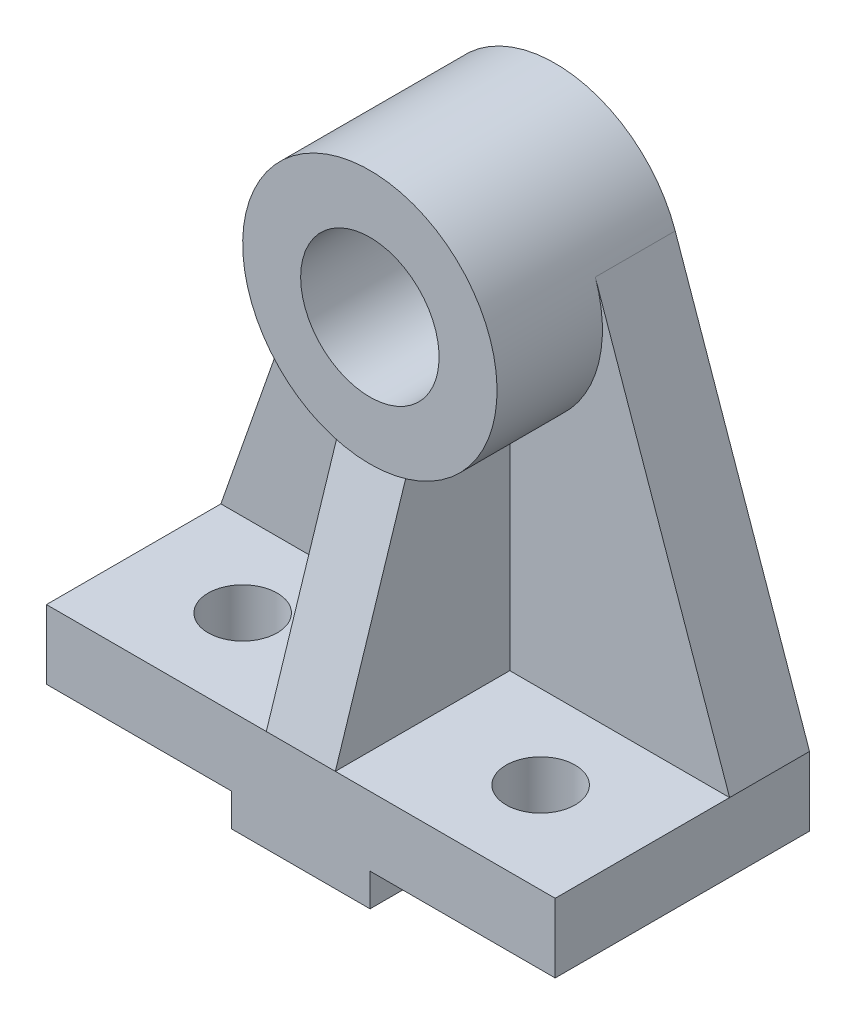
ISO-10303-21;
HEADER;
FILE_DESCRIPTION(('STEP AP214'),'2;1');
FILE_NAME('part.step','',(''),(''),'','','');
FILE_SCHEMA(('AUTOMOTIVE_DESIGN { 1 0 10303 214 1 1 1 1 }'));
ENDSEC;
DATA;
#1=APPLICATION_CONTEXT('core data for automotive mechanical design processes');
#2=APPLICATION_PROTOCOL_DEFINITION('international standard','automotive_design',2000,#1);
#3=PRODUCT_CONTEXT('',#1,'mechanical');
#4=PRODUCT('Part','Part','',(#3));
#5=PRODUCT_RELATED_PRODUCT_CATEGORY('part','',(#4));
#6=PRODUCT_DEFINITION_FORMATION('','',#4);
#7=PRODUCT_DEFINITION_CONTEXT('part definition',#1,'design');
#8=PRODUCT_DEFINITION('design','',#6,#7);
#9=PRODUCT_DEFINITION_SHAPE('','',#8);
#10=(LENGTH_UNIT() NAMED_UNIT(*) SI_UNIT(.MILLI.,.METRE.));
#11=(NAMED_UNIT(*) PLANE_ANGLE_UNIT() SI_UNIT($,.RADIAN.));
#12=(NAMED_UNIT(*) SI_UNIT($,.STERADIAN.) SOLID_ANGLE_UNIT());
#13=UNCERTAINTY_MEASURE_WITH_UNIT(LENGTH_MEASURE(1.E-05),#10,'distance_accuracy_value','');
#14=(GEOMETRIC_REPRESENTATION_CONTEXT(3) GLOBAL_UNCERTAINTY_ASSIGNED_CONTEXT((#13)) GLOBAL_UNIT_ASSIGNED_CONTEXT((#10,
#11,#12)) REPRESENTATION_CONTEXT('',''));
#15=CARTESIAN_POINT('',(0.,0.,0.));
#16=DIRECTION('',(0.,0.,1.));
#17=DIRECTION('',(1.,0.,0.));
#18=AXIS2_PLACEMENT_3D('',#15,#16,#17);
#19=CARTESIAN_POINT('',(0.,19.,0.));
#20=DIRECTION('',(0.,-1.,0.));
#21=DIRECTION('',(0.,0.,-1.));
#22=AXIS2_PLACEMENT_3D('',#19,#20,#21);
#23=PLANE('',#22);
#24=CARTESIAN_POINT('',(-41.,19.,9.99999999999999));
#25=DIRECTION('',(0.,1.,0.));
#26=DIRECTION('',(0.,0.,1.));
#27=AXIS2_PLACEMENT_3D('',#24,#25,#26);
#28=CIRCLE('',#27,9.5);
#29=CARTESIAN_POINT('',(-41.,19.,19.5));
#30=VERTEX_POINT('',#29);
#31=EDGE_CURVE('E266',#30,#30,#28,.T.);
#32=ORIENTED_EDGE('',*,*,#31,.F.);
#33=EDGE_LOOP('',(#32));
#34=FACE_BOUND('',#33,.T.);
#35=DIRECTION('',(0.,0.,1.));
#36=VECTOR('',#35,1.);
#37=CARTESIAN_POINT('',(-9.5,19.,0.));
#38=LINE('',#37,#36);
#39=CARTESIAN_POINT('',(-9.5,19.,-13.));
#40=VERTEX_POINT('',#39);
#41=CARTESIAN_POINT('',(-9.5,19.,35.));
#42=VERTEX_POINT('',#41);
#43=EDGE_CURVE('E143',#40,#42,#38,.T.);
#44=ORIENTED_EDGE('',*,*,#43,.F.);
#45=DIRECTION('',(-1.,0.,0.));
#46=VECTOR('',#45,1.);
#47=CARTESIAN_POINT('',(-70.,19.,-13.));
#48=LINE('',#47,#46);
#49=CARTESIAN_POINT('',(-70.,19.,-13.));
#50=VERTEX_POINT('',#49);
#51=EDGE_CURVE('E58',#40,#50,#48,.T.);
#52=ORIENTED_EDGE('',*,*,#51,.T.);
#53=DIRECTION('',(0.,0.,1.));
#54=VECTOR('',#53,1.);
#55=CARTESIAN_POINT('',(-70.,19.,35.));
#56=LINE('',#55,#54);
#57=CARTESIAN_POINT('',(-70.,19.,35.));
#58=VERTEX_POINT('',#57);
#59=EDGE_CURVE('E172',#50,#58,#56,.T.);
#60=ORIENTED_EDGE('',*,*,#59,.T.);
#61=DIRECTION('',(1.,0.,0.));
#62=VECTOR('',#61,1.);
#63=CARTESIAN_POINT('',(-70.,19.,35.));
#64=LINE('',#63,#62);
#65=EDGE_CURVE('E165',#58,#42,#64,.T.);
#66=ORIENTED_EDGE('',*,*,#65,.T.);
#67=EDGE_LOOP('',(#44,#52,#60,#66));
#68=FACE_BOUND('',#67,.T.);
#69=ADVANCED_FACE('F34',(#34,#68),#23,.F.);
#70=CARTESIAN_POINT('',(0.,113.,-13.));
#71=DIRECTION('',(0.,0.,-1.));
#72=DIRECTION('',(-1.,0.,0.));
#73=AXIS2_PLACEMENT_3D('',#70,#71,#72);
#74=PLANE('',#73);
#75=DIRECTION('',(0.,-1.,0.));
#76=VECTOR('',#75,1.);
#77=CARTESIAN_POINT('',(-9.5,113.,-13.));
#78=LINE('',#77,#76);
#79=CARTESIAN_POINT('',(-9.5,79.313949474597,-13.));
#80=VERTEX_POINT('',#79);
#81=EDGE_CURVE('E146',#80,#40,#78,.T.);
#82=ORIENTED_EDGE('',*,*,#81,.F.);
#83=CARTESIAN_POINT('',(0.,113.,-13.));
#84=DIRECTION('',(0.,0.,1.));
#85=DIRECTION('',(-1.,0.,0.));
#86=AXIS2_PLACEMENT_3D('',#83,#84,#85);
#87=CIRCLE('',#86,35.);
#88=CARTESIAN_POINT('',(-33.0332697516259,124.567328538445,-13.));
#89=VERTEX_POINT('',#88);
#90=EDGE_CURVE('E303',#89,#80,#87,.T.);
#91=ORIENTED_EDGE('',*,*,#90,.F.);
#92=DIRECTION('',(0.330495101098423,0.943807707189311,0.));
#93=VECTOR('',#92,1.);
#94=CARTESIAN_POINT('',(-33.0332697516259,124.567328538445,-13.));
#95=LINE('',#94,#93);
#96=EDGE_CURVE('E247',#50,#89,#95,.T.);
#97=ORIENTED_EDGE('',*,*,#96,.F.);
#98=ORIENTED_EDGE('',*,*,#51,.F.);
#99=EDGE_LOOP('',(#82,#91,#97,#98));
#100=FACE_BOUND('',#99,.T.);
#101=ADVANCED_FACE('F349',(#100),#74,.F.);
#102=CARTESIAN_POINT('',(0.,0.,0.));
#103=DIRECTION('',(0.,-1.,0.));
#104=DIRECTION('',(0.,0.,-1.));
#105=AXIS2_PLACEMENT_3D('',#102,#103,#104);
#106=PLANE('',#105);
#107=CARTESIAN_POINT('',(-41.,0.,9.99999999999999));
#108=DIRECTION('',(0.,-1.,0.));
#109=DIRECTION('',(0.,0.,-1.));
#110=AXIS2_PLACEMENT_3D('',#107,#108,#109);
#111=CIRCLE('',#110,9.5);
#112=CARTESIAN_POINT('',(-41.,0.,19.5));
#113=VERTEX_POINT('',#112);
#114=EDGE_CURVE('E229',#113,#113,#111,.T.);
#115=ORIENTED_EDGE('',*,*,#114,.F.);
#116=EDGE_LOOP('',(#115));
#117=FACE_BOUND('',#116,.T.);
#118=DIRECTION('',(-1.,0.,0.));
#119=VECTOR('',#118,1.);
#120=CARTESIAN_POINT('',(-70.,0.,-35.));
#121=LINE('',#120,#119);
#122=CARTESIAN_POINT('',(-19.05,0.,-35.));
#123=VERTEX_POINT('',#122);
#124=CARTESIAN_POINT('',(-70.,0.,-35.));
#125=VERTEX_POINT('',#124);
#126=EDGE_CURVE('E186',#123,#125,#121,.T.);
#127=ORIENTED_EDGE('',*,*,#126,.F.);
#128=DIRECTION('',(0.,0.,1.));
#129=VECTOR('',#128,1.);
#130=CARTESIAN_POINT('',(-19.05,0.,-74.1485631920253));
#131=LINE('',#130,#129);
#132=CARTESIAN_POINT('',(-19.05,0.,35.));
#133=VERTEX_POINT('',#132);
#134=EDGE_CURVE('E213',#123,#133,#131,.T.);
#135=ORIENTED_EDGE('',*,*,#134,.T.);
#136=DIRECTION('',(1.,0.,0.));
#137=VECTOR('',#136,1.);
#138=CARTESIAN_POINT('',(-70.,0.,35.));
#139=LINE('',#138,#137);
#140=CARTESIAN_POINT('',(-70.,0.,35.));
#141=VERTEX_POINT('',#140);
#142=EDGE_CURVE('E194',#141,#133,#139,.T.);
#143=ORIENTED_EDGE('',*,*,#142,.F.);
#144=DIRECTION('',(0.,0.,1.));
#145=VECTOR('',#144,1.);
#146=CARTESIAN_POINT('',(-70.,0.,35.));
#147=LINE('',#146,#145);
#148=EDGE_CURVE('E191',#125,#141,#147,.T.);
#149=ORIENTED_EDGE('',*,*,#148,.F.);
#150=EDGE_LOOP('',(#127,#135,#143,#149));
#151=FACE_BOUND('',#150,.T.);
#152=ADVANCED_FACE('F210',(#117,#151),#106,.T.);
#153=CARTESIAN_POINT('',(70.,19.,35.));
#154=DIRECTION('',(-1.,0.,0.));
#155=DIRECTION('',(0.,0.,1.));
#156=AXIS2_PLACEMENT_3D('',#153,#154,#155);
#157=PLANE('',#156);
#158=DIRECTION('',(0.,0.,-1.));
#159=VECTOR('',#158,1.);
#160=CARTESIAN_POINT('',(70.,0.,35.));
#161=LINE('',#160,#159);
#162=CARTESIAN_POINT('',(70.,0.,35.));
#163=VERTEX_POINT('',#162);
#164=CARTESIAN_POINT('',(70.,0.,-35.));
#165=VERTEX_POINT('',#164);
#166=EDGE_CURVE('E183',#163,#165,#161,.T.);
#167=ORIENTED_EDGE('',*,*,#166,.T.);
#168=DIRECTION('',(0.,-1.,0.));
#169=VECTOR('',#168,1.);
#170=CARTESIAN_POINT('',(70.,19.,-35.));
#171=LINE('',#170,#169);
#172=CARTESIAN_POINT('',(70.,19.,-35.));
#173=VERTEX_POINT('',#172);
#174=EDGE_CURVE('E11',#173,#165,#171,.T.);
#175=ORIENTED_EDGE('',*,*,#174,.F.);
#176=DIRECTION('',(0.,0.,-1.));
#177=VECTOR('',#176,1.);
#178=CARTESIAN_POINT('',(70.,19.,-13.));
#179=LINE('',#178,#177);
#180=CARTESIAN_POINT('',(70.,19.,-13.));
#181=VERTEX_POINT('',#180);
#182=EDGE_CURVE('E264',#181,#173,#179,.T.);
#183=ORIENTED_EDGE('',*,*,#182,.F.);
#184=DIRECTION('',(0.,0.,-1.));
#185=VECTOR('',#184,1.);
#186=CARTESIAN_POINT('',(70.,19.,35.));
#187=LINE('',#186,#185);
#188=CARTESIAN_POINT('',(70.,19.,35.));
#189=VERTEX_POINT('',#188);
#190=EDGE_CURVE('E196',#189,#181,#187,.T.);
#191=ORIENTED_EDGE('',*,*,#190,.F.);
#192=DIRECTION('',(0.,-1.,0.));
#193=VECTOR('',#192,1.);
#194=CARTESIAN_POINT('',(70.,19.,35.));
#195=LINE('',#194,#193);
#196=EDGE_CURVE('E174',#189,#163,#195,.T.);
#197=ORIENTED_EDGE('',*,*,#196,.T.);
#198=EDGE_LOOP('',(#167,#175,#183,#191,#197));
#199=FACE_BOUND('',#198,.T.);
#200=ADVANCED_FACE('F36',(#199),#157,.F.);
#201=CARTESIAN_POINT('',(-70.,19.,-35.));
#202=DIRECTION('',(0.,0.,1.));
#203=DIRECTION('',(1.,0.,0.));
#204=AXIS2_PLACEMENT_3D('',#201,#202,#203);
#205=PLANE('',#204);
#206=CARTESIAN_POINT('',(0.,113.,-35.));
#207=DIRECTION('',(0.,0.,-1.));
#208=DIRECTION('',(-1.,0.,0.));
#209=AXIS2_PLACEMENT_3D('',#206,#207,#208);
#210=CIRCLE('',#209,19.05);
#211=CARTESIAN_POINT('',(-19.05,113.,-35.));
#212=VERTEX_POINT('',#211);
#213=EDGE_CURVE('E168',#212,#212,#210,.T.);
#214=ORIENTED_EDGE('',*,*,#213,.F.);
#215=EDGE_LOOP('',(#214));
#216=FACE_BOUND('',#215,.T.);
#217=DIRECTION('',(-1.,0.,0.));
#218=VECTOR('',#217,1.);
#219=CARTESIAN_POINT('',(-19.05,-9.,-35.));
#220=LINE('',#219,#218);
#221=CARTESIAN_POINT('',(19.05,-9.,-35.));
#222=VERTEX_POINT('',#221);
#223=CARTESIAN_POINT('',(-19.05,-9.,-35.));
#224=VERTEX_POINT('',#223);
#225=EDGE_CURVE('E279',#222,#224,#220,.T.);
#226=ORIENTED_EDGE('',*,*,#225,.T.);
#227=DIRECTION('',(0.,1.,0.));
#228=VECTOR('',#227,1.);
#229=CARTESIAN_POINT('',(-19.05,-9.,-35.));
#230=LINE('',#229,#228);
#231=EDGE_CURVE('E236',#224,#123,#230,.T.);
#232=ORIENTED_EDGE('',*,*,#231,.T.);
#233=ORIENTED_EDGE('',*,*,#126,.T.);
#234=DIRECTION('',(0.,-1.,0.));
#235=VECTOR('',#234,1.);
#236=CARTESIAN_POINT('',(-70.,19.,-35.));
#237=LINE('',#236,#235);
#238=CARTESIAN_POINT('',(-70.,19.,-35.));
#239=VERTEX_POINT('',#238);
#240=EDGE_CURVE('E43',#239,#125,#237,.T.);
#241=ORIENTED_EDGE('',*,*,#240,.F.);
#242=DIRECTION('',(0.330495101098423,0.943807707189311,0.));
#243=VECTOR('',#242,1.);
#244=CARTESIAN_POINT('',(-33.0332697516259,124.567328538445,-35.));
#245=LINE('',#244,#243);
#246=CARTESIAN_POINT('',(-33.0332697516259,124.567328538445,-35.));
#247=VERTEX_POINT('',#246);
#248=EDGE_CURVE('E249',#239,#247,#245,.T.);
#249=ORIENTED_EDGE('',*,*,#248,.T.);
#250=CARTESIAN_POINT('',(0.,113.,-35.));
#251=DIRECTION('',(0.,0.,-1.));
#252=DIRECTION('',(-1.,0.,0.));
#253=AXIS2_PLACEMENT_3D('',#250,#251,#252);
#254=CIRCLE('',#253,35.);
#255=CARTESIAN_POINT('',(33.0332697516259,124.567328538445,-35.));
#256=VERTEX_POINT('',#255);
#257=EDGE_CURVE('E258',#247,#256,#254,.T.);
#258=ORIENTED_EDGE('',*,*,#257,.T.);
#259=DIRECTION('',(0.330495101098423,-0.943807707189311,0.));
#260=VECTOR('',#259,1.);
#261=CARTESIAN_POINT('',(70.,19.,-35.));
#262=LINE('',#261,#260);
#263=EDGE_CURVE('E252',#256,#173,#262,.T.);
#264=ORIENTED_EDGE('',*,*,#263,.T.);
#265=ORIENTED_EDGE('',*,*,#174,.T.);
#266=CARTESIAN_POINT('',(19.05,0.,-35.));
#267=VERTEX_POINT('',#266);
#268=EDGE_CURVE('E188',#165,#267,#121,.T.);
#269=ORIENTED_EDGE('',*,*,#268,.T.);
#270=DIRECTION('',(0.,-1.,0.));
#271=VECTOR('',#270,1.);
#272=CARTESIAN_POINT('',(19.05,-9.,-35.));
#273=LINE('',#272,#271);
#274=EDGE_CURVE('E187',#267,#222,#273,.T.);
#275=ORIENTED_EDGE('',*,*,#274,.T.);
#276=EDGE_LOOP('',(#226,#232,#233,#241,#249,#258,#264,#265,#269,#275));
#277=FACE_BOUND('',#276,.T.);
#278=ADVANCED_FACE('F282',(#216,#277),#205,.F.);
#279=CARTESIAN_POINT('',(-70.,19.,35.));
#280=DIRECTION('',(1.,0.,0.));
#281=DIRECTION('',(0.,0.,-1.));
#282=AXIS2_PLACEMENT_3D('',#279,#280,#281);
#283=PLANE('',#282);
#284=ORIENTED_EDGE('',*,*,#148,.T.);
#285=DIRECTION('',(0.,-1.,0.));
#286=VECTOR('',#285,1.);
#287=CARTESIAN_POINT('',(-70.,19.,35.));
#288=LINE('',#287,#286);
#289=EDGE_CURVE('E177',#58,#141,#288,.T.);
#290=ORIENTED_EDGE('',*,*,#289,.F.);
#291=ORIENTED_EDGE('',*,*,#59,.F.);
#292=EDGE_CURVE('E179',#239,#50,#56,.T.);
#293=ORIENTED_EDGE('',*,*,#292,.F.);
#294=ORIENTED_EDGE('',*,*,#240,.T.);
#295=EDGE_LOOP('',(#284,#290,#291,#293,#294));
#296=FACE_BOUND('',#295,.T.);
#297=ADVANCED_FACE('F204',(#296),#283,.F.);
#298=CARTESIAN_POINT('',(-70.,19.,35.));
#299=DIRECTION('',(0.,0.,-1.));
#300=DIRECTION('',(-1.,0.,0.));
#301=AXIS2_PLACEMENT_3D('',#298,#299,#300);
#302=PLANE('',#301);
#303=CARTESIAN_POINT('',(9.5,19.,35.));
#304=VERTEX_POINT('',#303);
#305=EDGE_CURVE('E167',#304,#189,#64,.T.);
#306=ORIENTED_EDGE('',*,*,#305,.F.);
#307=DIRECTION('',(1.,0.,0.));
#308=VECTOR('',#307,1.);
#309=CARTESIAN_POINT('',(0.,19.,35.));
#310=LINE('',#309,#308);
#311=EDGE_CURVE('E154',#304,#42,#310,.F.);
#312=ORIENTED_EDGE('',*,*,#311,.T.);
#313=ORIENTED_EDGE('',*,*,#65,.F.);
#314=ORIENTED_EDGE('',*,*,#289,.T.);
#315=ORIENTED_EDGE('',*,*,#142,.T.);
#316=DIRECTION('',(0.,-1.,0.));
#317=VECTOR('',#316,1.);
#318=CARTESIAN_POINT('',(-19.05,-9.,35.));
#319=LINE('',#318,#317);
#320=CARTESIAN_POINT('',(-19.05,-9.,35.));
#321=VERTEX_POINT('',#320);
#322=EDGE_CURVE('E216',#133,#321,#319,.T.);
#323=ORIENTED_EDGE('',*,*,#322,.T.);
#324=DIRECTION('',(1.,0.,0.));
#325=VECTOR('',#324,1.);
#326=CARTESIAN_POINT('',(-19.05,-9.,35.));
#327=LINE('',#326,#325);
#328=CARTESIAN_POINT('',(19.05,-9.,35.));
#329=VERTEX_POINT('',#328);
#330=EDGE_CURVE('E223',#321,#329,#327,.T.);
#331=ORIENTED_EDGE('',*,*,#330,.T.);
#332=DIRECTION('',(0.,1.,0.));
#333=VECTOR('',#332,1.);
#334=CARTESIAN_POINT('',(19.05,-9.,35.));
#335=LINE('',#334,#333);
#336=CARTESIAN_POINT('',(19.05,0.,35.));
#337=VERTEX_POINT('',#336);
#338=EDGE_CURVE('E224',#329,#337,#335,.T.);
#339=ORIENTED_EDGE('',*,*,#338,.T.);
#340=EDGE_CURVE('E193',#337,#163,#139,.T.);
#341=ORIENTED_EDGE('',*,*,#340,.T.);
#342=ORIENTED_EDGE('',*,*,#196,.F.);
#343=EDGE_LOOP('',(#306,#312,#313,#314,#315,#323,#331,#339,#341,#342));
#344=FACE_BOUND('',#343,.T.);
#345=ADVANCED_FACE('F163',(#344),#302,.F.);
#346=CARTESIAN_POINT('',(41.,19.,9.99999999999999));
#347=DIRECTION('',(0.,1.,0.));
#348=DIRECTION('',(0.,0.,1.));
#349=AXIS2_PLACEMENT_3D('',#346,#347,#348);
#350=CIRCLE('',#349,9.5);
#351=CARTESIAN_POINT('',(41.,19.,19.5));
#352=VERTEX_POINT('',#351);
#353=EDGE_CURVE('E271',#352,#352,#350,.T.);
#354=ORIENTED_EDGE('',*,*,#353,.F.);
#355=EDGE_LOOP('',(#354));
#356=FACE_BOUND('',#355,.T.);
#357=CARTESIAN_POINT('',(9.5,19.,-13.));
#358=VERTEX_POINT('',#357);
#359=EDGE_CURVE('E309',#181,#358,#48,.T.);
#360=ORIENTED_EDGE('',*,*,#359,.T.);
#361=DIRECTION('',(0.,0.,1.));
#362=VECTOR('',#361,1.);
#363=CARTESIAN_POINT('',(9.5,19.,0.));
#364=LINE('',#363,#362);
#365=EDGE_CURVE('E323',#358,#304,#364,.T.);
#366=ORIENTED_EDGE('',*,*,#365,.T.);
#367=ORIENTED_EDGE('',*,*,#305,.T.);
#368=ORIENTED_EDGE('',*,*,#190,.T.);
#369=EDGE_LOOP('',(#360,#366,#367,#368));
#370=FACE_BOUND('',#369,.T.);
#371=ADVANCED_FACE('F352',(#356,#370),#23,.F.);
#372=CARTESIAN_POINT('',(41.,0.,9.99999999999999));
#373=DIRECTION('',(0.,-1.,0.));
#374=DIRECTION('',(0.,0.,-1.));
#375=AXIS2_PLACEMENT_3D('',#372,#373,#374);
#376=CIRCLE('',#375,9.5);
#377=CARTESIAN_POINT('',(41.,0.,19.5));
#378=VERTEX_POINT('',#377);
#379=EDGE_CURVE('E38',#378,#378,#376,.T.);
#380=ORIENTED_EDGE('',*,*,#379,.F.);
#381=EDGE_LOOP('',(#380));
#382=FACE_BOUND('',#381,.T.);
#383=DIRECTION('',(0.,0.,1.));
#384=VECTOR('',#383,1.);
#385=CARTESIAN_POINT('',(19.05,0.,-74.1485631920253));
#386=LINE('',#385,#384);
#387=EDGE_CURVE('E226',#267,#337,#386,.T.);
#388=ORIENTED_EDGE('',*,*,#387,.F.);
#389=ORIENTED_EDGE('',*,*,#268,.F.);
#390=ORIENTED_EDGE('',*,*,#166,.F.);
#391=ORIENTED_EDGE('',*,*,#340,.F.);
#392=EDGE_LOOP('',(#388,#389,#390,#391));
#393=FACE_BOUND('',#392,.T.);
#394=ADVANCED_FACE('F294',(#382,#393),#106,.T.);
#395=CARTESIAN_POINT('',(19.05,-9.,-74.1485631920253));
#396=DIRECTION('',(1.,0.,0.));
#397=DIRECTION('',(0.,0.,-1.));
#398=AXIS2_PLACEMENT_3D('',#395,#396,#397);
#399=PLANE('',#398);
#400=ORIENTED_EDGE('',*,*,#274,.F.);
#401=ORIENTED_EDGE('',*,*,#387,.T.);
#402=ORIENTED_EDGE('',*,*,#338,.F.);
#403=DIRECTION('',(0.,0.,1.));
#404=VECTOR('',#403,1.);
#405=CARTESIAN_POINT('',(19.05,-9.,-74.1485631920253));
#406=LINE('',#405,#404);
#407=EDGE_CURVE('E233',#222,#329,#406,.T.);
#408=ORIENTED_EDGE('',*,*,#407,.F.);
#409=EDGE_LOOP('',(#400,#401,#402,#408));
#410=FACE_BOUND('',#409,.T.);
#411=ADVANCED_FACE('F288',(#410),#399,.T.);
#412=CARTESIAN_POINT('',(-19.05,-9.,-74.1485631920253));
#413=DIRECTION('',(0.,-1.,0.));
#414=DIRECTION('',(0.,0.,-1.));
#415=AXIS2_PLACEMENT_3D('',#412,#413,#414);
#416=PLANE('',#415);
#417=ORIENTED_EDGE('',*,*,#407,.T.);
#418=ORIENTED_EDGE('',*,*,#330,.F.);
#419=DIRECTION('',(0.,0.,1.));
#420=VECTOR('',#419,1.);
#421=CARTESIAN_POINT('',(-19.05,-9.,-74.1485631920253));
#422=LINE('',#421,#420);
#423=EDGE_CURVE('E222',#224,#321,#422,.T.);
#424=ORIENTED_EDGE('',*,*,#423,.F.);
#425=ORIENTED_EDGE('',*,*,#225,.F.);
#426=EDGE_LOOP('',(#417,#418,#424,#425));
#427=FACE_BOUND('',#426,.T.);
#428=ADVANCED_FACE('F286',(#427),#416,.T.);
#429=CARTESIAN_POINT('',(-19.05,-9.,-74.1485631920253));
#430=DIRECTION('',(-1.,0.,0.));
#431=DIRECTION('',(0.,0.,1.));
#432=AXIS2_PLACEMENT_3D('',#429,#430,#431);
#433=PLANE('',#432);
#434=ORIENTED_EDGE('',*,*,#231,.F.);
#435=ORIENTED_EDGE('',*,*,#423,.T.);
#436=ORIENTED_EDGE('',*,*,#322,.F.);
#437=ORIENTED_EDGE('',*,*,#134,.F.);
#438=EDGE_LOOP('',(#434,#435,#436,#437));
#439=FACE_BOUND('',#438,.T.);
#440=ADVANCED_FACE('F220',(#439),#433,.T.);
#441=CARTESIAN_POINT('',(41.,-9.,9.99999999999999));
#442=DIRECTION('',(0.,1.,0.));
#443=DIRECTION('',(0.,0.,1.));
#444=AXIS2_PLACEMENT_3D('',#441,#442,#443);
#445=CYLINDRICAL_SURFACE('',#444,9.5);
#446=CARTESIAN_POINT('',(41.,0.,19.5));
#447=CARTESIAN_POINT('',(41.,0.197916666666669,19.5));
#448=CARTESIAN_POINT('',(41.,0.395833333333335,19.5));
#449=CARTESIAN_POINT('',(41.,0.791666666666669,19.5));
#450=CARTESIAN_POINT('',(41.,0.989583333333335,19.5));
#451=CARTESIAN_POINT('',(41.,1.38541666666667,19.5));
#452=CARTESIAN_POINT('',(41.,1.58333333333333,19.5));
#453=CARTESIAN_POINT('',(41.,1.97916666666667,19.5));
#454=CARTESIAN_POINT('',(41.,2.17708333333333,19.5));
#455=CARTESIAN_POINT('',(41.,2.57291666666667,19.5));
#456=CARTESIAN_POINT('',(41.,2.77083333333333,19.5));
#457=CARTESIAN_POINT('',(41.,3.16666666666667,19.5));
#458=CARTESIAN_POINT('',(41.,3.36458333333333,19.5));
#459=CARTESIAN_POINT('',(41.,3.76041666666667,19.5));
#460=CARTESIAN_POINT('',(41.,3.95833333333334,19.5));
#461=CARTESIAN_POINT('',(41.,4.35416666666667,19.5));
#462=CARTESIAN_POINT('',(41.,4.55208333333333,19.5));
#463=CARTESIAN_POINT('',(41.,4.94791666666667,19.5));
#464=CARTESIAN_POINT('',(41.,5.14583333333333,19.5));
#465=CARTESIAN_POINT('',(41.,5.54166666666667,19.5));
#466=CARTESIAN_POINT('',(41.,5.73958333333333,19.5));
#467=CARTESIAN_POINT('',(41.,6.13541666666667,19.5));
#468=CARTESIAN_POINT('',(41.,6.33333333333333,19.5));
#469=CARTESIAN_POINT('',(41.,6.72916666666667,19.5));
#470=CARTESIAN_POINT('',(41.,6.92708333333333,19.5));
#471=CARTESIAN_POINT('',(41.,7.32291666666667,19.5));
#472=CARTESIAN_POINT('',(41.,7.52083333333333,19.5));
#473=CARTESIAN_POINT('',(41.,7.91666666666666,19.5));
#474=CARTESIAN_POINT('',(41.,8.11458333333333,19.5));
#475=CARTESIAN_POINT('',(41.,8.51041666666667,19.5));
#476=CARTESIAN_POINT('',(41.,8.70833333333333,19.5));
#477=CARTESIAN_POINT('',(41.,9.10416666666666,19.5));
#478=CARTESIAN_POINT('',(41.,9.30208333333333,19.5));
#479=CARTESIAN_POINT('',(41.,9.69791666666667,19.5));
#480=CARTESIAN_POINT('',(41.,9.89583333333333,19.5));
#481=CARTESIAN_POINT('',(41.,10.2916666666667,19.5));
#482=CARTESIAN_POINT('',(41.,10.4895833333333,19.5));
#483=CARTESIAN_POINT('',(41.,10.8854166666667,19.5));
#484=CARTESIAN_POINT('',(41.,11.0833333333333,19.5));
#485=CARTESIAN_POINT('',(41.,11.4791666666667,19.5));
#486=CARTESIAN_POINT('',(41.,11.6770833333333,19.5));
#487=CARTESIAN_POINT('',(41.,12.0729166666667,19.5));
#488=CARTESIAN_POINT('',(41.,12.2708333333333,19.5));
#489=CARTESIAN_POINT('',(41.,12.6666666666667,19.5));
#490=CARTESIAN_POINT('',(41.,12.8645833333333,19.5));
#491=CARTESIAN_POINT('',(41.,13.2604166666667,19.5));
#492=CARTESIAN_POINT('',(41.,13.4583333333333,19.5));
#493=CARTESIAN_POINT('',(41.,13.8541666666667,19.5));
#494=CARTESIAN_POINT('',(41.,14.0520833333333,19.5));
#495=CARTESIAN_POINT('',(41.,14.4479166666667,19.5));
#496=CARTESIAN_POINT('',(41.,14.6458333333333,19.5));
#497=CARTESIAN_POINT('',(41.,15.0416666666667,19.5));
#498=CARTESIAN_POINT('',(41.,15.2395833333333,19.5));
#499=CARTESIAN_POINT('',(41.,15.6354166666667,19.5));
#500=CARTESIAN_POINT('',(41.,15.8333333333333,19.5));
#501=CARTESIAN_POINT('',(41.,16.2291666666667,19.5));
#502=CARTESIAN_POINT('',(41.,16.4270833333333,19.5));
#503=CARTESIAN_POINT('',(41.,16.8229166666667,19.5));
#504=CARTESIAN_POINT('',(41.,17.0208333333333,19.5));
#505=CARTESIAN_POINT('',(41.,17.4166666666667,19.5));
#506=CARTESIAN_POINT('',(41.,17.6145833333333,19.5));
#507=CARTESIAN_POINT('',(41.,18.0104166666667,19.5));
#508=CARTESIAN_POINT('',(41.,18.2083333333333,19.5));
#509=CARTESIAN_POINT('',(41.,18.6041666666667,19.5));
#510=CARTESIAN_POINT('',(41.,18.8020833333333,19.5));
#511=CARTESIAN_POINT('',(41.,19.,19.5));
#512=B_SPLINE_CURVE_WITH_KNOTS('',3,(#446,#447,#448,#449,#450,#451,#452,#453,#454,#455,#456,
#457,#458,#459,#460,#461,#462,#463,#464,#465,#466,#467,#468,#469,#470,#471,#472,#473,#474,#475,
#476,#477,#478,#479,#480,#481,#482,#483,#484,#485,#486,#487,#488,#489,#490,#491,#492,#493,#494,
#495,#496,#497,#498,#499,#500,#501,#502,#503,#504,#505,#506,#507,#508,#509,#510,#511),
.UNSPECIFIED.,.F.,.F.,(4,2,2,2,2,2,2,2,2,2,2,2,2,2,2,2,2,2,2,2,2,2,2,2,2,2,2,2,2,2,2,2,4),(0.,
0.593750000000001,1.1875,1.78125,2.375,2.96875,3.5625,4.15625,4.75,5.34375,5.9375,6.53125,7.125,
7.71874999999999,8.3125,8.90625,9.5,10.09375,10.6875,11.28125,11.875,12.46875,13.0625,13.65625,
14.25,14.84375,15.4375,16.03125,16.625,17.21875,17.8125,18.40625,19.),.UNSPECIFIED.);
#513=EDGE_CURVE('BSEAM489',#378,#352,#512,.T.);
#514=ORIENTED_EDGE('',*,*,#379,.T.);
#515=ORIENTED_EDGE('',*,*,#353,.T.);
#516=ORIENTED_EDGE('',*,*,#513,.T.);
#517=ORIENTED_EDGE('',*,*,#513,.F.);
#518=EDGE_LOOP('',(#514,#516,#515,#517));
#519=FACE_BOUND('',#518,.T.);
#520=ADVANCED_FACE('F489',(#519),#445,.F.);
#521=CARTESIAN_POINT('',(-41.,-9.,9.99999999999999));
#522=DIRECTION('',(0.,1.,0.));
#523=DIRECTION('',(0.,0.,1.));
#524=AXIS2_PLACEMENT_3D('',#521,#522,#523);
#525=CYLINDRICAL_SURFACE('',#524,9.5);
#526=CARTESIAN_POINT('',(-41.,0.,19.5));
#527=CARTESIAN_POINT('',(-41.,0.197916666666669,19.5));
#528=CARTESIAN_POINT('',(-41.,0.395833333333335,19.5));
#529=CARTESIAN_POINT('',(-41.,0.791666666666669,19.5));
#530=CARTESIAN_POINT('',(-41.,0.989583333333335,19.5));
#531=CARTESIAN_POINT('',(-41.,1.38541666666667,19.5));
#532=CARTESIAN_POINT('',(-41.,1.58333333333333,19.5));
#533=CARTESIAN_POINT('',(-41.,1.97916666666667,19.5));
#534=CARTESIAN_POINT('',(-41.,2.17708333333333,19.5));
#535=CARTESIAN_POINT('',(-41.,2.57291666666667,19.5));
#536=CARTESIAN_POINT('',(-41.,2.77083333333333,19.5));
#537=CARTESIAN_POINT('',(-41.,3.16666666666667,19.5));
#538=CARTESIAN_POINT('',(-41.,3.36458333333333,19.5));
#539=CARTESIAN_POINT('',(-41.,3.76041666666667,19.5));
#540=CARTESIAN_POINT('',(-41.,3.95833333333334,19.5));
#541=CARTESIAN_POINT('',(-41.,4.35416666666667,19.5));
#542=CARTESIAN_POINT('',(-41.,4.55208333333333,19.5));
#543=CARTESIAN_POINT('',(-41.,4.94791666666667,19.5));
#544=CARTESIAN_POINT('',(-41.,5.14583333333333,19.5));
#545=CARTESIAN_POINT('',(-41.,5.54166666666667,19.5));
#546=CARTESIAN_POINT('',(-41.,5.73958333333333,19.5));
#547=CARTESIAN_POINT('',(-41.,6.13541666666667,19.5));
#548=CARTESIAN_POINT('',(-41.,6.33333333333333,19.5));
#549=CARTESIAN_POINT('',(-41.,6.72916666666667,19.5));
#550=CARTESIAN_POINT('',(-41.,6.92708333333333,19.5));
#551=CARTESIAN_POINT('',(-41.,7.32291666666667,19.5));
#552=CARTESIAN_POINT('',(-41.,7.52083333333333,19.5));
#553=CARTESIAN_POINT('',(-41.,7.91666666666666,19.5));
#554=CARTESIAN_POINT('',(-41.,8.11458333333333,19.5));
#555=CARTESIAN_POINT('',(-41.,8.51041666666667,19.5));
#556=CARTESIAN_POINT('',(-41.,8.70833333333333,19.5));
#557=CARTESIAN_POINT('',(-41.,9.10416666666666,19.5));
#558=CARTESIAN_POINT('',(-41.,9.30208333333333,19.5));
#559=CARTESIAN_POINT('',(-41.,9.69791666666667,19.5));
#560=CARTESIAN_POINT('',(-41.,9.89583333333333,19.5));
#561=CARTESIAN_POINT('',(-41.,10.2916666666667,19.5));
#562=CARTESIAN_POINT('',(-41.,10.4895833333333,19.5));
#563=CARTESIAN_POINT('',(-41.,10.8854166666667,19.5));
#564=CARTESIAN_POINT('',(-41.,11.0833333333333,19.5));
#565=CARTESIAN_POINT('',(-41.,11.4791666666667,19.5));
#566=CARTESIAN_POINT('',(-41.,11.6770833333333,19.5));
#567=CARTESIAN_POINT('',(-41.,12.0729166666667,19.5));
#568=CARTESIAN_POINT('',(-41.,12.2708333333333,19.5));
#569=CARTESIAN_POINT('',(-41.,12.6666666666667,19.5));
#570=CARTESIAN_POINT('',(-41.,12.8645833333333,19.5));
#571=CARTESIAN_POINT('',(-41.,13.2604166666667,19.5));
#572=CARTESIAN_POINT('',(-41.,13.4583333333333,19.5));
#573=CARTESIAN_POINT('',(-41.,13.8541666666667,19.5));
#574=CARTESIAN_POINT('',(-41.,14.0520833333333,19.5));
#575=CARTESIAN_POINT('',(-41.,14.4479166666667,19.5));
#576=CARTESIAN_POINT('',(-41.,14.6458333333333,19.5));
#577=CARTESIAN_POINT('',(-41.,15.0416666666667,19.5));
#578=CARTESIAN_POINT('',(-41.,15.2395833333333,19.5));
#579=CARTESIAN_POINT('',(-41.,15.6354166666667,19.5));
#580=CARTESIAN_POINT('',(-41.,15.8333333333333,19.5));
#581=CARTESIAN_POINT('',(-41.,16.2291666666667,19.5));
#582=CARTESIAN_POINT('',(-41.,16.4270833333333,19.5));
#583=CARTESIAN_POINT('',(-41.,16.8229166666667,19.5));
#584=CARTESIAN_POINT('',(-41.,17.0208333333333,19.5));
#585=CARTESIAN_POINT('',(-41.,17.4166666666667,19.5));
#586=CARTESIAN_POINT('',(-41.,17.6145833333333,19.5));
#587=CARTESIAN_POINT('',(-41.,18.0104166666667,19.5));
#588=CARTESIAN_POINT('',(-41.,18.2083333333333,19.5));
#589=CARTESIAN_POINT('',(-41.,18.6041666666667,19.5));
#590=CARTESIAN_POINT('',(-41.,18.8020833333333,19.5));
#591=CARTESIAN_POINT('',(-41.,19.,19.5));
#592=B_SPLINE_CURVE_WITH_KNOTS('',3,(#526,#527,#528,#529,#530,#531,#532,#533,#534,#535,#536,
#537,#538,#539,#540,#541,#542,#543,#544,#545,#546,#547,#548,#549,#550,#551,#552,#553,#554,#555,
#556,#557,#558,#559,#560,#561,#562,#563,#564,#565,#566,#567,#568,#569,#570,#571,#572,#573,#574,
#575,#576,#577,#578,#579,#580,#581,#582,#583,#584,#585,#586,#587,#588,#589,#590,#591),
.UNSPECIFIED.,.F.,.F.,(4,2,2,2,2,2,2,2,2,2,2,2,2,2,2,2,2,2,2,2,2,2,2,2,2,2,2,2,2,2,2,2,4),(0.,
0.593750000000001,1.1875,1.78125,2.375,2.96875,3.5625,4.15625,4.75,5.34375,5.9375,6.53125,7.125,
7.71874999999999,8.3125,8.90625,9.5,10.09375,10.6875,11.28125,11.875,12.46875,13.0625,13.65625,
14.25,14.84375,15.4375,16.03125,16.625,17.21875,17.8125,18.40625,19.),.UNSPECIFIED.);
#593=EDGE_CURVE('BSEAM467',#113,#30,#592,.T.);
#594=ORIENTED_EDGE('',*,*,#114,.T.);
#595=ORIENTED_EDGE('',*,*,#31,.T.);
#596=ORIENTED_EDGE('',*,*,#593,.T.);
#597=ORIENTED_EDGE('',*,*,#593,.F.);
#598=EDGE_LOOP('',(#594,#596,#595,#597));
#599=FACE_BOUND('',#598,.T.);
#600=ADVANCED_FACE('F467',(#599),#525,.F.);
#601=CARTESIAN_POINT('',(70.,19.,-13.));
#602=DIRECTION('',(0.943807707189311,0.330495101098423,0.));
#603=DIRECTION('',(-0.330495101098423,0.943807707189311,0.));
#604=AXIS2_PLACEMENT_3D('',#601,#602,#603);
#605=PLANE('',#604);
#606=ORIENTED_EDGE('',*,*,#263,.F.);
#607=DIRECTION('',(0.,0.,-1.));
#608=VECTOR('',#607,1.);
#609=CARTESIAN_POINT('',(33.0332697516259,124.567328538445,-13.));
#610=LINE('',#609,#608);
#611=CARTESIAN_POINT('',(33.0332697516259,124.567328538445,-13.));
#612=VERTEX_POINT('',#611);
#613=EDGE_CURVE('E267',#612,#256,#610,.T.);
#614=ORIENTED_EDGE('',*,*,#613,.F.);
#615=DIRECTION('',(0.330495101098423,-0.943807707189311,0.));
#616=VECTOR('',#615,1.);
#617=CARTESIAN_POINT('',(70.,19.,-13.));
#618=LINE('',#617,#616);
#619=EDGE_CURVE('E261',#612,#181,#618,.T.);
#620=ORIENTED_EDGE('',*,*,#619,.T.);
#621=ORIENTED_EDGE('',*,*,#182,.T.);
#622=EDGE_LOOP('',(#606,#614,#620,#621));
#623=FACE_BOUND('',#622,.T.);
#624=ADVANCED_FACE('F298',(#623),#605,.T.);
#625=CARTESIAN_POINT('',(-33.0332697516259,124.567328538445,-13.));
#626=DIRECTION('',(-0.943807707189311,0.330495101098423,0.));
#627=DIRECTION('',(-0.330495101098423,-0.943807707189311,0.));
#628=AXIS2_PLACEMENT_3D('',#625,#626,#627);
#629=PLANE('',#628);
#630=ORIENTED_EDGE('',*,*,#248,.F.);
#631=ORIENTED_EDGE('',*,*,#292,.T.);
#632=ORIENTED_EDGE('',*,*,#96,.T.);
#633=DIRECTION('',(0.,0.,-1.));
#634=VECTOR('',#633,1.);
#635=CARTESIAN_POINT('',(-33.0332697516259,124.567328538445,-13.));
#636=LINE('',#635,#634);
#637=EDGE_CURVE('E250',#89,#247,#636,.T.);
#638=ORIENTED_EDGE('',*,*,#637,.T.);
#639=EDGE_LOOP('',(#630,#631,#632,#638));
#640=FACE_BOUND('',#639,.T.);
#641=ADVANCED_FACE('F246',(#640),#629,.T.);
#642=CARTESIAN_POINT('',(9.5,79.3139494745971,-13.));
#643=VERTEX_POINT('',#642);
#644=EDGE_CURVE('E305',#643,#612,#87,.T.);
#645=ORIENTED_EDGE('',*,*,#644,.F.);
#646=DIRECTION('',(0.,-1.,0.));
#647=VECTOR('',#646,1.);
#648=CARTESIAN_POINT('',(9.5,113.,-13.));
#649=LINE('',#648,#647);
#650=EDGE_CURVE('E320',#643,#358,#649,.T.);
#651=ORIENTED_EDGE('',*,*,#650,.T.);
#652=ORIENTED_EDGE('',*,*,#359,.F.);
#653=ORIENTED_EDGE('',*,*,#619,.F.);
#654=EDGE_LOOP('',(#645,#651,#652,#653));
#655=FACE_BOUND('',#654,.T.);
#656=ADVANCED_FACE('F346',(#655),#74,.F.);
#657=CARTESIAN_POINT('',(0.,113.,16.));
#658=DIRECTION('',(0.,0.,-1.));
#659=DIRECTION('',(-1.,0.,0.));
#660=AXIS2_PLACEMENT_3D('',#657,#658,#659);
#661=CYLINDRICAL_SURFACE('',#660,35.);
#662=ORIENTED_EDGE('',*,*,#613,.T.);
#663=ORIENTED_EDGE('',*,*,#257,.F.);
#664=ORIENTED_EDGE('',*,*,#637,.F.);
#665=ORIENTED_EDGE('',*,*,#90,.T.);
#666=DIRECTION('',(0.,0.,-1.));
#667=VECTOR('',#666,1.);
#668=CARTESIAN_POINT('',(-9.5,79.3139494745971,16.));
#669=LINE('',#668,#667);
#670=CARTESIAN_POINT('',(-9.5,79.3139494745971,15.5768637285196));
#671=VERTEX_POINT('',#670);
#672=EDGE_CURVE('E326',#80,#671,#669,.F.);
#673=ORIENTED_EDGE('',*,*,#672,.T.);
#674=CARTESIAN_POINT('',(0.,113.,4.72881355932202));
#675=DIRECTION('',(0.,-0.306531366089457,-0.951860557856733));
#676=DIRECTION('',(0.,0.951860557856733,-0.306531366089457));
#677=AXIS2_PLACEMENT_3D('',#674,#675,#676);
#678=ELLIPSE('',#677,36.7700917020956,35.);
#679=CARTESIAN_POINT('',(0.,78.,16.));
#680=VERTEX_POINT('',#679);
#681=EDGE_CURVE('E157',#680,#671,#678,.T.);
#682=ORIENTED_EDGE('',*,*,#681,.F.);
#683=CARTESIAN_POINT('',(0.,113.,16.));
#684=DIRECTION('',(0.,0.,-1.));
#685=DIRECTION('',(-1.,0.,0.));
#686=AXIS2_PLACEMENT_3D('',#683,#684,#685);
#687=CIRCLE('',#686,35.);
#688=EDGE_CURVE('E253',#680,#680,#687,.T.);
#689=ORIENTED_EDGE('',*,*,#688,.T.);
#690=CARTESIAN_POINT('',(9.5,79.3139494745971,15.5768637285196));
#691=VERTEX_POINT('',#690);
#692=EDGE_CURVE('E169',#691,#680,#678,.T.);
#693=ORIENTED_EDGE('',*,*,#692,.F.);
#694=DIRECTION('',(0.,0.,-1.));
#695=VECTOR('',#694,1.);
#696=CARTESIAN_POINT('',(9.5,79.3139494745971,16.));
#697=LINE('',#696,#695);
#698=EDGE_CURVE('E318',#643,#691,#697,.F.);
#699=ORIENTED_EDGE('',*,*,#698,.F.);
#700=ORIENTED_EDGE('',*,*,#644,.T.);
#701=EDGE_LOOP('',(#662,#663,#664,#665,#673,#682,#689,#693,#699,#700));
#702=FACE_BOUND('',#701,.T.);
#703=ADVANCED_FACE('F332',(#702),#661,.T.);
#704=CARTESIAN_POINT('',(0.,113.,16.));
#705=DIRECTION('',(0.,0.,-1.));
#706=DIRECTION('',(-1.,0.,0.));
#707=AXIS2_PLACEMENT_3D('',#704,#705,#706);
#708=PLANE('',#707);
#709=CARTESIAN_POINT('',(0.,113.,16.));
#710=DIRECTION('',(0.,0.,-1.));
#711=DIRECTION('',(-1.,0.,0.));
#712=AXIS2_PLACEMENT_3D('',#709,#710,#711);
#713=CIRCLE('',#712,19.05);
#714=CARTESIAN_POINT('',(-19.05,113.,16.));
#715=VERTEX_POINT('',#714);
#716=EDGE_CURVE('E311',#715,#715,#713,.T.);
#717=ORIENTED_EDGE('',*,*,#716,.T.);
#718=EDGE_LOOP('',(#717));
#719=FACE_BOUND('',#718,.T.);
#720=ORIENTED_EDGE('',*,*,#688,.F.);
#721=EDGE_LOOP('',(#720));
#722=FACE_BOUND('',#721,.T.);
#723=ADVANCED_FACE('F335',(#719,#722),#708,.F.);
#724=CARTESIAN_POINT('',(0.,113.,16.));
#725=DIRECTION('',(0.,0.,-1.));
#726=DIRECTION('',(-1.,0.,0.));
#727=AXIS2_PLACEMENT_3D('',#724,#725,#726);
#728=CYLINDRICAL_SURFACE('',#727,19.05);
#729=ORIENTED_EDGE('',*,*,#213,.T.);
#730=EDGE_LOOP('',(#729));
#731=FACE_BOUND('',#730,.T.);
#732=ORIENTED_EDGE('',*,*,#716,.F.);
#733=EDGE_LOOP('',(#732));
#734=FACE_BOUND('',#733,.T.);
#735=ADVANCED_FACE('F337',(#731,#734),#728,.F.);
#736=CARTESIAN_POINT('',(0.,19.,35.));
#737=DIRECTION('',(0.,-0.306531366089457,-0.951860557856733));
#738=DIRECTION('',(0.,0.951860557856733,-0.306531366089457));
#739=AXIS2_PLACEMENT_3D('',#736,#737,#738);
#740=PLANE('',#739);
#741=ORIENTED_EDGE('',*,*,#311,.F.);
#742=DIRECTION('',(0.,0.951860557856733,-0.306531366089457));
#743=VECTOR('',#742,1.);
#744=CARTESIAN_POINT('',(9.5,19.,35.));
#745=LINE('',#744,#743);
#746=EDGE_CURVE('E148',#304,#691,#745,.T.);
#747=ORIENTED_EDGE('',*,*,#746,.T.);
#748=ORIENTED_EDGE('',*,*,#692,.T.);
#749=ORIENTED_EDGE('',*,*,#681,.T.);
#750=DIRECTION('',(0.,0.951860557856733,-0.306531366089457));
#751=VECTOR('',#750,1.);
#752=CARTESIAN_POINT('',(-9.5,19.,35.));
#753=LINE('',#752,#751);
#754=EDGE_CURVE('E50',#42,#671,#753,.T.);
#755=ORIENTED_EDGE('',*,*,#754,.F.);
#756=EDGE_LOOP('',(#741,#747,#748,#749,#755));
#757=FACE_BOUND('',#756,.T.);
#758=ADVANCED_FACE('F152',(#757),#740,.F.);
#759=CARTESIAN_POINT('',(9.5,69.5,0.));
#760=DIRECTION('',(1.,0.,0.));
#761=DIRECTION('',(0.,0.,-1.));
#762=AXIS2_PLACEMENT_3D('',#759,#760,#761);
#763=PLANE('',#762);
#764=ORIENTED_EDGE('',*,*,#650,.F.);
#765=ORIENTED_EDGE('',*,*,#698,.T.);
#766=ORIENTED_EDGE('',*,*,#746,.F.);
#767=ORIENTED_EDGE('',*,*,#365,.F.);
#768=EDGE_LOOP('',(#764,#765,#766,#767));
#769=FACE_BOUND('',#768,.T.);
#770=ADVANCED_FACE('F370',(#769),#763,.T.);
#771=CARTESIAN_POINT('',(-9.5,69.5,0.));
#772=DIRECTION('',(1.,0.,0.));
#773=DIRECTION('',(0.,0.,-1.));
#774=AXIS2_PLACEMENT_3D('',#771,#772,#773);
#775=PLANE('',#774);
#776=ORIENTED_EDGE('',*,*,#672,.F.);
#777=ORIENTED_EDGE('',*,*,#81,.T.);
#778=ORIENTED_EDGE('',*,*,#43,.T.);
#779=ORIENTED_EDGE('',*,*,#754,.T.);
#780=EDGE_LOOP('',(#776,#777,#778,#779));
#781=FACE_BOUND('',#780,.T.);
#782=ADVANCED_FACE('F144',(#781),#775,.F.);
#783=CLOSED_SHELL('',(#69,#101,#152,#200,#278,#297,#345,#371,#394,#411,#428,#440,#520,#600,#624,
#641,#656,#703,#723,#735,#758,#770,#782));
#784=MANIFOLD_SOLID_BREP('B2',#783);
#785=ADVANCED_BREP_SHAPE_REPRESENTATION('',(#18,#784),#14);
#786=SHAPE_DEFINITION_REPRESENTATION(#9,#785);
ENDSEC;
END-ISO-10303-21;
